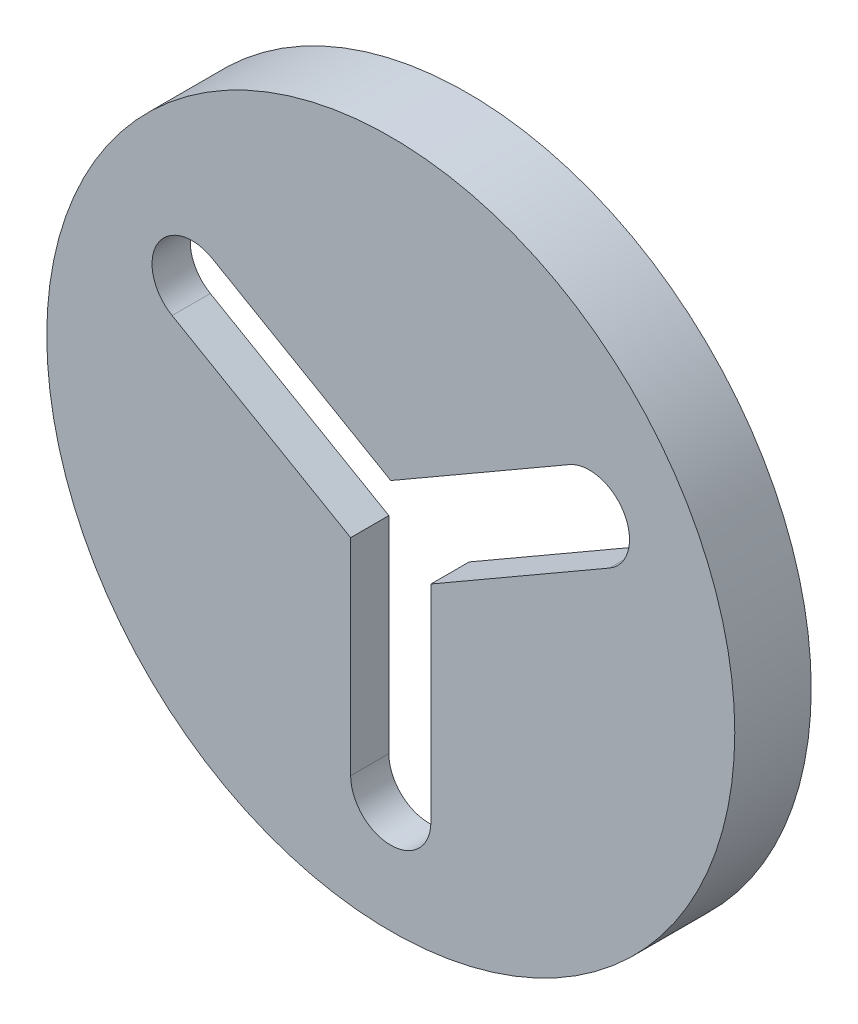
ISO-10303-21;
HEADER;
FILE_DESCRIPTION(('STEP AP214'),'2;1');
FILE_NAME('part.step','',(''),(''),'','','');
FILE_SCHEMA(('AUTOMOTIVE_DESIGN { 1 0 10303 214 1 1 1 1 }'));
ENDSEC;
DATA;
#1=APPLICATION_CONTEXT('core data for automotive mechanical design processes');
#2=APPLICATION_PROTOCOL_DEFINITION('international standard','automotive_design',2000,#1);
#3=PRODUCT_CONTEXT('',#1,'mechanical');
#4=PRODUCT('Part','Part','',(#3));
#5=PRODUCT_RELATED_PRODUCT_CATEGORY('part','',(#4));
#6=PRODUCT_DEFINITION_FORMATION('','',#4);
#7=PRODUCT_DEFINITION_CONTEXT('part definition',#1,'design');
#8=PRODUCT_DEFINITION('design','',#6,#7);
#9=PRODUCT_DEFINITION_SHAPE('','',#8);
#10=(LENGTH_UNIT() NAMED_UNIT(*) SI_UNIT(.MILLI.,.METRE.));
#11=(NAMED_UNIT(*) PLANE_ANGLE_UNIT() SI_UNIT($,.RADIAN.));
#12=(NAMED_UNIT(*) SI_UNIT($,.STERADIAN.) SOLID_ANGLE_UNIT());
#13=UNCERTAINTY_MEASURE_WITH_UNIT(LENGTH_MEASURE(1.E-05),#10,'distance_accuracy_value','');
#14=(GEOMETRIC_REPRESENTATION_CONTEXT(3) GLOBAL_UNCERTAINTY_ASSIGNED_CONTEXT((#13)) GLOBAL_UNIT_ASSIGNED_CONTEXT((#10,
#11,#12)) REPRESENTATION_CONTEXT('',''));
#15=CARTESIAN_POINT('',(0.,0.,0.));
#16=DIRECTION('',(0.,0.,1.));
#17=DIRECTION('',(1.,0.,0.));
#18=AXIS2_PLACEMENT_3D('',#15,#16,#17);
#19=CARTESIAN_POINT('',(0.,0.,5.));
#20=DIRECTION('',(0.,0.,1.));
#21=DIRECTION('',(1.,0.,0.));
#22=AXIS2_PLACEMENT_3D('',#19,#20,#21);
#23=PLANE('',#22);
#24=DIRECTION('',(0.,-1.,0.));
#25=VECTOR('',#24,1.);
#26=CARTESIAN_POINT('',(-5.25,0.,5.));
#27=LINE('',#26,#25);
#28=CARTESIAN_POINT('',(-5.25,-3.03108891324552,5.));
#29=VERTEX_POINT('',#28);
#30=CARTESIAN_POINT('',(-5.25,-30.,5.));
#31=VERTEX_POINT('',#30);
#32=EDGE_CURVE('E205',#29,#31,#27,.T.);
#33=ORIENTED_EDGE('',*,*,#32,.F.);
#34=DIRECTION('',(-0.866025403784436,0.500000000000004,0.));
#35=VECTOR('',#34,1.);
#36=CARTESIAN_POINT('',(-2.62500000000002,-4.54663336986829,5.));
#37=LINE('',#36,#35);
#38=CARTESIAN_POINT('',(-28.6057621135331,10.4533666301318,5.));
#39=VERTEX_POINT('',#38);
#40=EDGE_CURVE('E128',#29,#39,#37,.T.);
#41=ORIENTED_EDGE('',*,*,#40,.T.);
#42=CARTESIAN_POINT('',(-25.9807621135331,15.0000000000001,5.));
#43=DIRECTION('',(0.,0.,1.));
#44=DIRECTION('',(1.,0.,0.));
#45=AXIS2_PLACEMENT_3D('',#42,#43,#44);
#46=CIRCLE('',#45,5.25);
#47=CARTESIAN_POINT('',(-23.3557621135331,19.5466333698684,5.));
#48=VERTEX_POINT('',#47);
#49=EDGE_CURVE('E193',#48,#39,#46,.T.);
#50=ORIENTED_EDGE('',*,*,#49,.F.);
#51=DIRECTION('',(-0.866025403784436,0.500000000000004,0.));
#52=VECTOR('',#51,1.);
#53=CARTESIAN_POINT('',(2.62500000000002,4.54663336986829,5.));
#54=LINE('',#53,#52);
#55=CARTESIAN_POINT('',(0.,6.06217782649106,5.));
#56=VERTEX_POINT('',#55);
#57=EDGE_CURVE('E200',#56,#48,#54,.T.);
#58=ORIENTED_EDGE('',*,*,#57,.F.);
#59=DIRECTION('',(0.866025403784443,0.499999999999992,0.));
#60=VECTOR('',#59,1.);
#61=CARTESIAN_POINT('',(-2.62499999999996,4.54663336986833,5.));
#62=LINE('',#61,#60);
#63=CARTESIAN_POINT('',(23.3557621135333,19.5466333698681,5.));
#64=VERTEX_POINT('',#63);
#65=EDGE_CURVE('E221',#56,#64,#62,.T.);
#66=ORIENTED_EDGE('',*,*,#65,.T.);
#67=CARTESIAN_POINT('',(25.9807621135333,14.9999999999998,5.));
#68=DIRECTION('',(0.,0.,1.));
#69=DIRECTION('',(1.,0.,0.));
#70=AXIS2_PLACEMENT_3D('',#67,#68,#69);
#71=CIRCLE('',#70,5.25);
#72=CARTESIAN_POINT('',(28.6057621135333,10.4533666301314,5.));
#73=VERTEX_POINT('',#72);
#74=EDGE_CURVE('E225',#73,#64,#71,.T.);
#75=ORIENTED_EDGE('',*,*,#74,.F.);
#76=DIRECTION('',(0.866025403784443,0.499999999999992,0.));
#77=VECTOR('',#76,1.);
#78=CARTESIAN_POINT('',(2.62499999999996,-4.54663336986833,5.));
#79=LINE('',#78,#77);
#80=CARTESIAN_POINT('',(5.25,-3.03108891324557,5.));
#81=VERTEX_POINT('',#80);
#82=EDGE_CURVE('E230',#81,#73,#79,.T.);
#83=ORIENTED_EDGE('',*,*,#82,.F.);
#84=DIRECTION('',(0.,-1.,0.));
#85=VECTOR('',#84,1.);
#86=CARTESIAN_POINT('',(5.25,0.,5.));
#87=LINE('',#86,#85);
#88=CARTESIAN_POINT('',(5.25,-30.,5.));
#89=VERTEX_POINT('',#88);
#90=EDGE_CURVE('E239',#81,#89,#87,.T.);
#91=ORIENTED_EDGE('',*,*,#90,.T.);
#92=CARTESIAN_POINT('',(0.,-30.,5.));
#93=DIRECTION('',(0.,0.,1.));
#94=DIRECTION('',(1.,0.,0.));
#95=AXIS2_PLACEMENT_3D('',#92,#93,#94);
#96=CIRCLE('',#95,5.25);
#97=EDGE_CURVE('E243',#31,#89,#96,.T.);
#98=ORIENTED_EDGE('',*,*,#97,.F.);
#99=EDGE_LOOP('',(#33,#41,#50,#58,#66,#75,#83,#91,#98));
#100=FACE_BOUND('',#99,.T.);
#101=CARTESIAN_POINT('',(0.,0.,5.));
#102=DIRECTION('',(0.,0.,1.));
#103=DIRECTION('',(1.,0.,0.));
#104=AXIS2_PLACEMENT_3D('',#101,#102,#103);
#105=CIRCLE('',#104,45.);
#106=CARTESIAN_POINT('',(45.,0.,5.));
#107=VERTEX_POINT('',#106);
#108=EDGE_CURVE('E214',#107,#107,#105,.T.);
#109=ORIENTED_EDGE('',*,*,#108,.T.);
#110=EDGE_LOOP('',(#109));
#111=FACE_BOUND('',#110,.T.);
#112=ADVANCED_FACE('F112',(#100,#111),#23,.T.);
#113=CARTESIAN_POINT('',(0.,0.,0.));
#114=DIRECTION('',(0.,0.,1.));
#115=DIRECTION('',(1.,0.,0.));
#116=AXIS2_PLACEMENT_3D('',#113,#114,#115);
#117=PLANE('',#116);
#118=DIRECTION('',(-0.866025403784436,0.500000000000004,0.));
#119=VECTOR('',#118,1.);
#120=CARTESIAN_POINT('',(-2.62500000000002,-4.54663336986829,0.));
#121=LINE('',#120,#119);
#122=CARTESIAN_POINT('',(-5.25,-3.03108891324552,0.));
#123=VERTEX_POINT('',#122);
#124=CARTESIAN_POINT('',(-28.6057621135331,10.4533666301318,0.));
#125=VERTEX_POINT('',#124);
#126=EDGE_CURVE('E12',#123,#125,#121,.T.);
#127=ORIENTED_EDGE('',*,*,#126,.F.);
#128=DIRECTION('',(0.,-1.,0.));
#129=VECTOR('',#128,1.);
#130=CARTESIAN_POINT('',(-5.25,0.,0.));
#131=LINE('',#130,#129);
#132=CARTESIAN_POINT('',(-5.25,-30.,0.));
#133=VERTEX_POINT('',#132);
#134=EDGE_CURVE('E257',#123,#133,#131,.T.);
#135=ORIENTED_EDGE('',*,*,#134,.T.);
#136=CARTESIAN_POINT('',(0.,-30.,0.));
#137=DIRECTION('',(0.,0.,1.));
#138=DIRECTION('',(1.,0.,0.));
#139=AXIS2_PLACEMENT_3D('',#136,#137,#138);
#140=CIRCLE('',#139,5.25);
#141=CARTESIAN_POINT('',(5.25,-30.,0.));
#142=VERTEX_POINT('',#141);
#143=EDGE_CURVE('E264',#133,#142,#140,.T.);
#144=ORIENTED_EDGE('',*,*,#143,.T.);
#145=DIRECTION('',(0.,-1.,0.));
#146=VECTOR('',#145,1.);
#147=CARTESIAN_POINT('',(5.25,0.,0.));
#148=LINE('',#147,#146);
#149=CARTESIAN_POINT('',(5.25,-3.03108891324557,0.));
#150=VERTEX_POINT('',#149);
#151=EDGE_CURVE('E268',#150,#142,#148,.T.);
#152=ORIENTED_EDGE('',*,*,#151,.F.);
#153=DIRECTION('',(0.866025403784443,0.499999999999992,0.));
#154=VECTOR('',#153,1.);
#155=CARTESIAN_POINT('',(2.62499999999996,-4.54663336986833,0.));
#156=LINE('',#155,#154);
#157=CARTESIAN_POINT('',(28.6057621135333,10.4533666301314,0.));
#158=VERTEX_POINT('',#157);
#159=EDGE_CURVE('E271',#150,#158,#156,.T.);
#160=ORIENTED_EDGE('',*,*,#159,.T.);
#161=CARTESIAN_POINT('',(25.9807621135333,14.9999999999998,0.));
#162=DIRECTION('',(0.,0.,1.));
#163=DIRECTION('',(1.,0.,0.));
#164=AXIS2_PLACEMENT_3D('',#161,#162,#163);
#165=CIRCLE('',#164,5.25);
#166=CARTESIAN_POINT('',(23.3557621135333,19.5466333698681,0.));
#167=VERTEX_POINT('',#166);
#168=EDGE_CURVE('E275',#158,#167,#165,.T.);
#169=ORIENTED_EDGE('',*,*,#168,.T.);
#170=DIRECTION('',(0.866025403784443,0.499999999999992,0.));
#171=VECTOR('',#170,1.);
#172=CARTESIAN_POINT('',(-2.62499999999996,4.54663336986833,0.));
#173=LINE('',#172,#171);
#174=CARTESIAN_POINT('',(0.,6.06217782649106,0.));
#175=VERTEX_POINT('',#174);
#176=EDGE_CURVE('E279',#175,#167,#173,.T.);
#177=ORIENTED_EDGE('',*,*,#176,.F.);
#178=DIRECTION('',(-0.866025403784436,0.500000000000004,0.));
#179=VECTOR('',#178,1.);
#180=CARTESIAN_POINT('',(2.62500000000002,4.54663336986829,0.));
#181=LINE('',#180,#179);
#182=CARTESIAN_POINT('',(-23.3557621135331,19.5466333698684,0.));
#183=VERTEX_POINT('',#182);
#184=EDGE_CURVE('E282',#175,#183,#181,.T.);
#185=ORIENTED_EDGE('',*,*,#184,.T.);
#186=CARTESIAN_POINT('',(-25.9807621135331,15.0000000000001,0.));
#187=DIRECTION('',(0.,0.,1.));
#188=DIRECTION('',(1.,0.,0.));
#189=AXIS2_PLACEMENT_3D('',#186,#187,#188);
#190=CIRCLE('',#189,5.25);
#191=EDGE_CURVE('E121',#183,#125,#190,.T.);
#192=ORIENTED_EDGE('',*,*,#191,.T.);
#193=EDGE_LOOP('',(#127,#135,#144,#152,#160,#169,#177,#185,#192));
#194=FACE_BOUND('',#193,.T.);
#195=CARTESIAN_POINT('',(0.,0.,0.));
#196=DIRECTION('',(0.,0.,-1.));
#197=DIRECTION('',(-1.,0.,0.));
#198=AXIS2_PLACEMENT_3D('',#195,#196,#197);
#199=CIRCLE('',#198,41.);
#200=CARTESIAN_POINT('',(-41.,0.,0.));
#201=VERTEX_POINT('',#200);
#202=EDGE_CURVE('E358',#201,#201,#199,.T.);
#203=ORIENTED_EDGE('',*,*,#202,.T.);
#204=EDGE_LOOP('',(#203));
#205=FACE_BOUND('',#204,.T.);
#206=ADVANCED_FACE('F114',(#194,#205),#117,.F.);
#207=CARTESIAN_POINT('',(-2.62500000000002,-4.54663336986829,-5.));
#208=DIRECTION('',(0.500000000000004,0.866025403784436,0.));
#209=DIRECTION('',(-0.866025403784436,0.500000000000004,0.));
#210=AXIS2_PLACEMENT_3D('',#207,#208,#209);
#211=PLANE('',#210);
#212=ORIENTED_EDGE('',*,*,#126,.T.);
#213=DIRECTION('',(0.,0.,1.));
#214=VECTOR('',#213,1.);
#215=CARTESIAN_POINT('',(-28.6057621135331,10.4533666301318,-5.));
#216=LINE('',#215,#214);
#217=EDGE_CURVE('E182',#125,#39,#216,.T.);
#218=ORIENTED_EDGE('',*,*,#217,.T.);
#219=ORIENTED_EDGE('',*,*,#40,.F.);
#220=DIRECTION('',(0.,0.,1.));
#221=VECTOR('',#220,1.);
#222=CARTESIAN_POINT('',(-5.25,-3.03108891324552,-5.));
#223=LINE('',#222,#221);
#224=EDGE_CURVE('E254',#123,#29,#223,.T.);
#225=ORIENTED_EDGE('',*,*,#224,.F.);
#226=EDGE_LOOP('',(#212,#218,#219,#225));
#227=FACE_BOUND('',#226,.T.);
#228=ADVANCED_FACE('F184',(#227),#211,.T.);
#229=CARTESIAN_POINT('',(-25.9807621135331,15.0000000000001,-5.));
#230=DIRECTION('',(0.,0.,1.));
#231=DIRECTION('',(1.,0.,0.));
#232=AXIS2_PLACEMENT_3D('',#229,#230,#231);
#233=CYLINDRICAL_SURFACE('',#232,5.25);
#234=DIRECTION('',(0.,0.,1.));
#235=VECTOR('',#234,1.);
#236=CARTESIAN_POINT('',(-23.3557621135331,19.5466333698684,-5.));
#237=LINE('',#236,#235);
#238=EDGE_CURVE('E190',#183,#48,#237,.T.);
#239=ORIENTED_EDGE('',*,*,#238,.T.);
#240=ORIENTED_EDGE('',*,*,#49,.T.);
#241=ORIENTED_EDGE('',*,*,#217,.F.);
#242=ORIENTED_EDGE('',*,*,#191,.F.);
#243=EDGE_LOOP('',(#239,#240,#241,#242));
#244=FACE_BOUND('',#243,.T.);
#245=ADVANCED_FACE('F194',(#244),#233,.F.);
#246=CARTESIAN_POINT('',(2.62500000000002,4.54663336986829,-5.));
#247=DIRECTION('',(0.500000000000004,0.866025403784436,0.));
#248=DIRECTION('',(-0.866025403784436,0.500000000000004,0.));
#249=AXIS2_PLACEMENT_3D('',#246,#247,#248);
#250=PLANE('',#249);
#251=DIRECTION('',(0.,0.,-1.));
#252=VECTOR('',#251,1.);
#253=CARTESIAN_POINT('',(0.,6.06217782649106,-5.));
#254=LINE('',#253,#252);
#255=EDGE_CURVE('E189',#56,#175,#254,.T.);
#256=ORIENTED_EDGE('',*,*,#255,.F.);
#257=ORIENTED_EDGE('',*,*,#57,.T.);
#258=ORIENTED_EDGE('',*,*,#238,.F.);
#259=ORIENTED_EDGE('',*,*,#184,.F.);
#260=EDGE_LOOP('',(#256,#257,#258,#259));
#261=FACE_BOUND('',#260,.T.);
#262=ADVANCED_FACE('F290',(#261),#250,.F.);
#263=CARTESIAN_POINT('',(-2.62499999999996,4.54663336986833,-5.));
#264=DIRECTION('',(0.499999999999992,-0.866025403784443,0.));
#265=DIRECTION('',(0.866025403784443,0.499999999999992,0.));
#266=AXIS2_PLACEMENT_3D('',#263,#264,#265);
#267=PLANE('',#266);
#268=ORIENTED_EDGE('',*,*,#176,.T.);
#269=DIRECTION('',(0.,0.,1.));
#270=VECTOR('',#269,1.);
#271=CARTESIAN_POINT('',(23.3557621135333,19.5466333698681,-5.));
#272=LINE('',#271,#270);
#273=EDGE_CURVE('E211',#167,#64,#272,.T.);
#274=ORIENTED_EDGE('',*,*,#273,.T.);
#275=ORIENTED_EDGE('',*,*,#65,.F.);
#276=ORIENTED_EDGE('',*,*,#255,.T.);
#277=EDGE_LOOP('',(#268,#274,#275,#276));
#278=FACE_BOUND('',#277,.T.);
#279=ADVANCED_FACE('F295',(#278),#267,.T.);
#280=CARTESIAN_POINT('',(25.9807621135333,14.9999999999998,-5.));
#281=DIRECTION('',(0.,0.,1.));
#282=DIRECTION('',(1.,0.,0.));
#283=AXIS2_PLACEMENT_3D('',#280,#281,#282);
#284=CYLINDRICAL_SURFACE('',#283,5.25);
#285=DIRECTION('',(0.,0.,1.));
#286=VECTOR('',#285,1.);
#287=CARTESIAN_POINT('',(28.6057621135333,10.4533666301314,-5.));
#288=LINE('',#287,#286);
#289=EDGE_CURVE('E234',#158,#73,#288,.T.);
#290=ORIENTED_EDGE('',*,*,#289,.T.);
#291=ORIENTED_EDGE('',*,*,#74,.T.);
#292=ORIENTED_EDGE('',*,*,#273,.F.);
#293=ORIENTED_EDGE('',*,*,#168,.F.);
#294=EDGE_LOOP('',(#290,#291,#292,#293));
#295=FACE_BOUND('',#294,.T.);
#296=ADVANCED_FACE('F298',(#295),#284,.F.);
#297=CARTESIAN_POINT('',(2.62499999999996,-4.54663336986833,-5.));
#298=DIRECTION('',(0.499999999999992,-0.866025403784443,0.));
#299=DIRECTION('',(0.866025403784443,0.499999999999992,0.));
#300=AXIS2_PLACEMENT_3D('',#297,#298,#299);
#301=PLANE('',#300);
#302=DIRECTION('',(0.,0.,-1.));
#303=VECTOR('',#302,1.);
#304=CARTESIAN_POINT('',(5.25,-3.03108891324557,-5.));
#305=LINE('',#304,#303);
#306=EDGE_CURVE('E207',#81,#150,#305,.T.);
#307=ORIENTED_EDGE('',*,*,#306,.F.);
#308=ORIENTED_EDGE('',*,*,#82,.T.);
#309=ORIENTED_EDGE('',*,*,#289,.F.);
#310=ORIENTED_EDGE('',*,*,#159,.F.);
#311=EDGE_LOOP('',(#307,#308,#309,#310));
#312=FACE_BOUND('',#311,.T.);
#313=ADVANCED_FACE('F301',(#312),#301,.F.);
#314=CARTESIAN_POINT('',(5.25,0.,-5.));
#315=DIRECTION('',(-1.,0.,0.));
#316=DIRECTION('',(0.,0.,1.));
#317=AXIS2_PLACEMENT_3D('',#314,#315,#316);
#318=PLANE('',#317);
#319=ORIENTED_EDGE('',*,*,#151,.T.);
#320=DIRECTION('',(0.,0.,1.));
#321=VECTOR('',#320,1.);
#322=CARTESIAN_POINT('',(5.25,-30.,-5.));
#323=LINE('',#322,#321);
#324=EDGE_CURVE('E226',#142,#89,#323,.T.);
#325=ORIENTED_EDGE('',*,*,#324,.T.);
#326=ORIENTED_EDGE('',*,*,#90,.F.);
#327=ORIENTED_EDGE('',*,*,#306,.T.);
#328=EDGE_LOOP('',(#319,#325,#326,#327));
#329=FACE_BOUND('',#328,.T.);
#330=ADVANCED_FACE('F304',(#329),#318,.T.);
#331=CARTESIAN_POINT('',(0.,-30.,-5.));
#332=DIRECTION('',(0.,0.,1.));
#333=DIRECTION('',(1.,0.,0.));
#334=AXIS2_PLACEMENT_3D('',#331,#332,#333);
#335=CYLINDRICAL_SURFACE('',#334,5.25);
#336=DIRECTION('',(0.,0.,1.));
#337=VECTOR('',#336,1.);
#338=CARTESIAN_POINT('',(-5.25,-30.,-5.));
#339=LINE('',#338,#337);
#340=EDGE_CURVE('E136',#133,#31,#339,.T.);
#341=ORIENTED_EDGE('',*,*,#340,.T.);
#342=ORIENTED_EDGE('',*,*,#97,.T.);
#343=ORIENTED_EDGE('',*,*,#324,.F.);
#344=ORIENTED_EDGE('',*,*,#143,.F.);
#345=EDGE_LOOP('',(#341,#342,#343,#344));
#346=FACE_BOUND('',#345,.T.);
#347=ADVANCED_FACE('F308',(#346),#335,.F.);
#348=CARTESIAN_POINT('',(-5.25,0.,-5.));
#349=DIRECTION('',(-1.,0.,0.));
#350=DIRECTION('',(0.,-1.,0.));
#351=AXIS2_PLACEMENT_3D('',#348,#349,#350);
#352=PLANE('',#351);
#353=ORIENTED_EDGE('',*,*,#224,.T.);
#354=ORIENTED_EDGE('',*,*,#32,.T.);
#355=ORIENTED_EDGE('',*,*,#340,.F.);
#356=ORIENTED_EDGE('',*,*,#134,.F.);
#357=EDGE_LOOP('',(#353,#354,#355,#356));
#358=FACE_BOUND('',#357,.T.);
#359=ADVANCED_FACE('F309',(#358),#352,.F.);
#360=CARTESIAN_POINT('',(0.,0.,-5.));
#361=DIRECTION('',(0.,0.,1.));
#362=DIRECTION('',(1.,0.,0.));
#363=AXIS2_PLACEMENT_3D('',#360,#361,#362);
#364=CYLINDRICAL_SURFACE('',#363,45.);
#365=CARTESIAN_POINT('',(0.,0.,-5.));
#366=DIRECTION('',(0.,0.,1.));
#367=DIRECTION('',(1.,0.,0.));
#368=AXIS2_PLACEMENT_3D('',#365,#366,#367);
#369=CIRCLE('',#368,45.);
#370=CARTESIAN_POINT('',(45.,0.,-5.));
#371=VERTEX_POINT('',#370);
#372=EDGE_CURVE('E244',#371,#371,#369,.T.);
#373=ORIENTED_EDGE('',*,*,#372,.T.);
#374=EDGE_LOOP('',(#373));
#375=FACE_BOUND('',#374,.T.);
#376=ORIENTED_EDGE('',*,*,#108,.F.);
#377=EDGE_LOOP('',(#376));
#378=FACE_BOUND('',#377,.T.);
#379=ADVANCED_FACE('F311',(#375,#378),#364,.T.);
#380=CARTESIAN_POINT('',(0.,0.,-5.));
#381=DIRECTION('',(0.,0.,1.));
#382=DIRECTION('',(1.,0.,0.));
#383=AXIS2_PLACEMENT_3D('',#380,#381,#382);
#384=PLANE('',#383);
#385=CARTESIAN_POINT('',(0.,0.,-5.));
#386=DIRECTION('',(0.,0.,-1.));
#387=DIRECTION('',(-1.,0.,0.));
#388=AXIS2_PLACEMENT_3D('',#385,#386,#387);
#389=CIRCLE('',#388,41.);
#390=CARTESIAN_POINT('',(-41.,0.,-5.));
#391=VERTEX_POINT('',#390);
#392=EDGE_CURVE('E361',#391,#391,#389,.T.);
#393=ORIENTED_EDGE('',*,*,#392,.F.);
#394=EDGE_LOOP('',(#393));
#395=FACE_BOUND('',#394,.T.);
#396=ORIENTED_EDGE('',*,*,#372,.F.);
#397=EDGE_LOOP('',(#396));
#398=FACE_BOUND('',#397,.T.);
#399=ADVANCED_FACE('F318',(#395,#398),#384,.F.);
#400=CARTESIAN_POINT('',(0.,0.,0.));
#401=DIRECTION('',(0.,0.,-1.));
#402=DIRECTION('',(-1.,0.,0.));
#403=AXIS2_PLACEMENT_3D('',#400,#401,#402);
#404=CYLINDRICAL_SURFACE('',#403,41.);
#405=ORIENTED_EDGE('',*,*,#202,.F.);
#406=EDGE_LOOP('',(#405));
#407=FACE_BOUND('',#406,.T.);
#408=ORIENTED_EDGE('',*,*,#392,.T.);
#409=EDGE_LOOP('',(#408));
#410=FACE_BOUND('',#409,.T.);
#411=ADVANCED_FACE('F349',(#407,#410),#404,.F.);
#412=CLOSED_SHELL('',(#112,#206,#228,#245,#262,#279,#296,#313,#330,#347,#359,#379,#399,#411));
#413=MANIFOLD_SOLID_BREP('B2',#412);
#414=ADVANCED_BREP_SHAPE_REPRESENTATION('',(#18,#413),#14);
#415=SHAPE_DEFINITION_REPRESENTATION(#9,#414);
ENDSEC;
END-ISO-10303-21;
